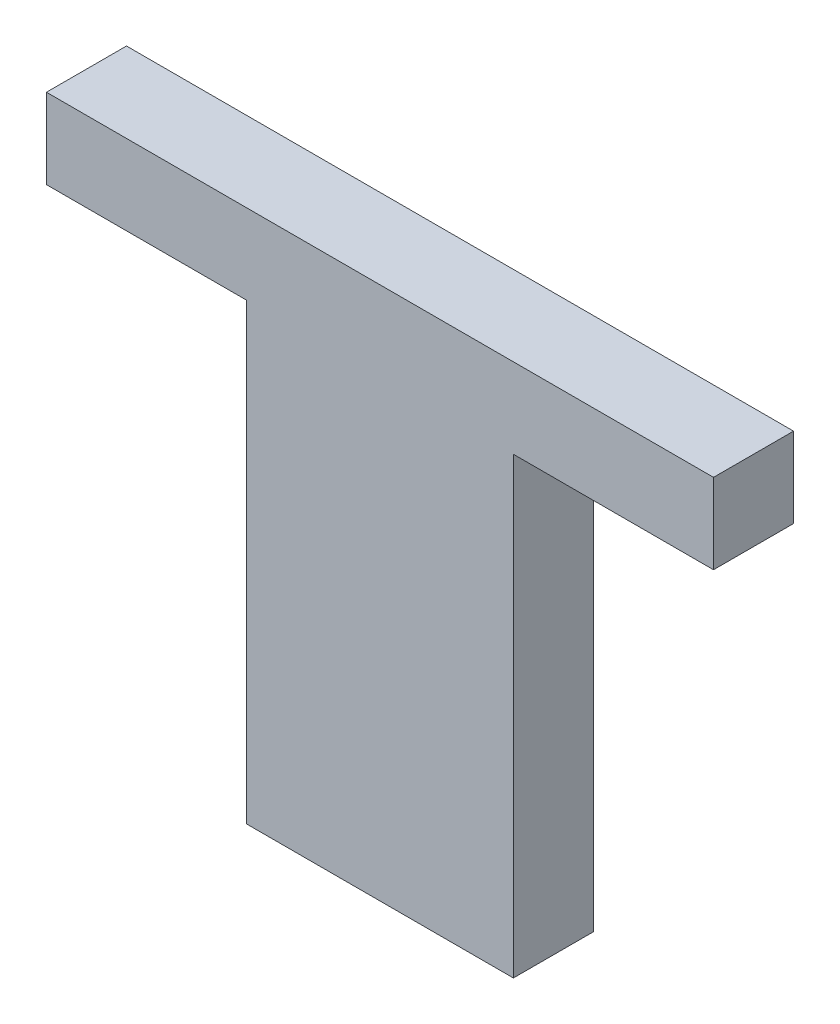
ISO-10303-21;
HEADER;
FILE_DESCRIPTION(('STEP AP214'),'2;1');
FILE_NAME('part.step','',(''),(''),'','','');
FILE_SCHEMA(('AUTOMOTIVE_DESIGN { 1 0 10303 214 1 1 1 1 }'));
ENDSEC;
DATA;
#1=APPLICATION_CONTEXT('core data for automotive mechanical design processes');
#2=APPLICATION_PROTOCOL_DEFINITION('international standard','automotive_design',2000,#1);
#3=PRODUCT_CONTEXT('',#1,'mechanical');
#4=PRODUCT('Part','Part','',(#3));
#5=PRODUCT_RELATED_PRODUCT_CATEGORY('part','',(#4));
#6=PRODUCT_DEFINITION_FORMATION('','',#4);
#7=PRODUCT_DEFINITION_CONTEXT('part definition',#1,'design');
#8=PRODUCT_DEFINITION('design','',#6,#7);
#9=PRODUCT_DEFINITION_SHAPE('','',#8);
#10=(LENGTH_UNIT() NAMED_UNIT(*) SI_UNIT(.MILLI.,.METRE.));
#11=(NAMED_UNIT(*) PLANE_ANGLE_UNIT() SI_UNIT($,.RADIAN.));
#12=(NAMED_UNIT(*) SI_UNIT($,.STERADIAN.) SOLID_ANGLE_UNIT());
#13=UNCERTAINTY_MEASURE_WITH_UNIT(LENGTH_MEASURE(1.E-05),#10,'distance_accuracy_value','');
#14=(GEOMETRIC_REPRESENTATION_CONTEXT(3) GLOBAL_UNCERTAINTY_ASSIGNED_CONTEXT((#13)) GLOBAL_UNIT_ASSIGNED_CONTEXT((#10,
#11,#12)) REPRESENTATION_CONTEXT('',''));
#15=CARTESIAN_POINT('',(0.,0.,0.));
#16=DIRECTION('',(0.,0.,1.));
#17=DIRECTION('',(1.,0.,0.));
#18=AXIS2_PLACEMENT_3D('',#15,#16,#17);
#19=CARTESIAN_POINT('',(0.,0.,6.));
#20=DIRECTION('',(1.,0.,0.));
#21=DIRECTION('',(0.,1.,0.));
#22=AXIS2_PLACEMENT_3D('',#19,#20,#21);
#23=PLANE('',#22);
#24=DIRECTION('',(0.,-1.,0.));
#25=VECTOR('',#24,1.);
#26=CARTESIAN_POINT('',(0.,0.,0.));
#27=LINE('',#26,#25);
#28=CARTESIAN_POINT('',(0.,40.,0.));
#29=VERTEX_POINT('',#28);
#30=CARTESIAN_POINT('',(0.,34.,0.));
#31=VERTEX_POINT('',#30);
#32=EDGE_CURVE('E123',#29,#31,#27,.T.);
#33=ORIENTED_EDGE('',*,*,#32,.T.);
#34=DIRECTION('',(0.,0.,1.));
#35=VECTOR('',#34,1.);
#36=CARTESIAN_POINT('',(0.,34.,0.));
#37=LINE('',#36,#35);
#38=CARTESIAN_POINT('',(0.,34.,6.));
#39=VERTEX_POINT('',#38);
#40=EDGE_CURVE('E139',#31,#39,#37,.T.);
#41=ORIENTED_EDGE('',*,*,#40,.T.);
#42=DIRECTION('',(0.,-1.,0.));
#43=VECTOR('',#42,1.);
#44=CARTESIAN_POINT('',(0.,0.,6.));
#45=LINE('',#44,#43);
#46=CARTESIAN_POINT('',(0.,40.,6.));
#47=VERTEX_POINT('',#46);
#48=EDGE_CURVE('E120',#47,#39,#45,.T.);
#49=ORIENTED_EDGE('',*,*,#48,.F.);
#50=DIRECTION('',(0.,0.,-1.));
#51=VECTOR('',#50,1.);
#52=CARTESIAN_POINT('',(0.,40.,6.));
#53=LINE('',#52,#51);
#54=EDGE_CURVE('E40',#47,#29,#53,.T.);
#55=ORIENTED_EDGE('',*,*,#54,.T.);
#56=EDGE_LOOP('',(#33,#41,#49,#55));
#57=FACE_BOUND('',#56,.T.);
#58=ADVANCED_FACE('F33',(#57),#23,.F.);
#59=CARTESIAN_POINT('',(0.,0.,6.));
#60=DIRECTION('',(0.,1.,0.));
#61=DIRECTION('',(0.,0.,1.));
#62=AXIS2_PLACEMENT_3D('',#59,#60,#61);
#63=PLANE('',#62);
#64=DIRECTION('',(1.,0.,0.));
#65=VECTOR('',#64,1.);
#66=CARTESIAN_POINT('',(0.,0.,0.));
#67=LINE('',#66,#65);
#68=CARTESIAN_POINT('',(15.,0.,0.));
#69=VERTEX_POINT('',#68);
#70=CARTESIAN_POINT('',(35.,0.,0.));
#71=VERTEX_POINT('',#70);
#72=EDGE_CURVE('E118',#69,#71,#67,.T.);
#73=ORIENTED_EDGE('',*,*,#72,.T.);
#74=DIRECTION('',(0.,0.,1.));
#75=VECTOR('',#74,1.);
#76=CARTESIAN_POINT('',(35.,0.,0.));
#77=LINE('',#76,#75);
#78=CARTESIAN_POINT('',(35.,0.,6.));
#79=VERTEX_POINT('',#78);
#80=EDGE_CURVE('E163',#71,#79,#77,.T.);
#81=ORIENTED_EDGE('',*,*,#80,.T.);
#82=DIRECTION('',(1.,0.,0.));
#83=VECTOR('',#82,1.);
#84=CARTESIAN_POINT('',(0.,0.,6.));
#85=LINE('',#84,#83);
#86=CARTESIAN_POINT('',(15.,0.,6.));
#87=VERTEX_POINT('',#86);
#88=EDGE_CURVE('E136',#87,#79,#85,.T.);
#89=ORIENTED_EDGE('',*,*,#88,.F.);
#90=DIRECTION('',(0.,0.,1.));
#91=VECTOR('',#90,1.);
#92=CARTESIAN_POINT('',(15.,0.,0.));
#93=LINE('',#92,#91);
#94=EDGE_CURVE('E143',#69,#87,#93,.T.);
#95=ORIENTED_EDGE('',*,*,#94,.F.);
#96=EDGE_LOOP('',(#73,#81,#89,#95));
#97=FACE_BOUND('',#96,.T.);
#98=ADVANCED_FACE('F161',(#97),#63,.F.);
#99=CARTESIAN_POINT('',(50.,0.,6.));
#100=DIRECTION('',(-1.,0.,0.));
#101=DIRECTION('',(0.,-1.,0.));
#102=AXIS2_PLACEMENT_3D('',#99,#100,#101);
#103=PLANE('',#102);
#104=DIRECTION('',(0.,1.,0.));
#105=VECTOR('',#104,1.);
#106=CARTESIAN_POINT('',(50.,0.,6.));
#107=LINE('',#106,#105);
#108=CARTESIAN_POINT('',(50.,34.,6.));
#109=VERTEX_POINT('',#108);
#110=CARTESIAN_POINT('',(50.,40.,6.));
#111=VERTEX_POINT('',#110);
#112=EDGE_CURVE('E112',#109,#111,#107,.T.);
#113=ORIENTED_EDGE('',*,*,#112,.F.);
#114=DIRECTION('',(0.,0.,1.));
#115=VECTOR('',#114,1.);
#116=CARTESIAN_POINT('',(50.,34.,0.));
#117=LINE('',#116,#115);
#118=CARTESIAN_POINT('',(50.,34.,0.));
#119=VERTEX_POINT('',#118);
#120=EDGE_CURVE('E100',#119,#109,#117,.T.);
#121=ORIENTED_EDGE('',*,*,#120,.F.);
#122=DIRECTION('',(0.,1.,0.));
#123=VECTOR('',#122,1.);
#124=CARTESIAN_POINT('',(50.,0.,0.));
#125=LINE('',#124,#123);
#126=CARTESIAN_POINT('',(50.,40.,0.));
#127=VERTEX_POINT('',#126);
#128=EDGE_CURVE('E111',#119,#127,#125,.T.);
#129=ORIENTED_EDGE('',*,*,#128,.T.);
#130=DIRECTION('',(0.,0.,-1.));
#131=VECTOR('',#130,1.);
#132=CARTESIAN_POINT('',(50.,40.,6.));
#133=LINE('',#132,#131);
#134=EDGE_CURVE('E11',#111,#127,#133,.T.);
#135=ORIENTED_EDGE('',*,*,#134,.F.);
#136=EDGE_LOOP('',(#113,#121,#129,#135));
#137=FACE_BOUND('',#136,.T.);
#138=ADVANCED_FACE('F109',(#137),#103,.F.);
#139=CARTESIAN_POINT('',(0.,40.,6.));
#140=DIRECTION('',(0.,-1.,0.));
#141=DIRECTION('',(0.,0.,-1.));
#142=AXIS2_PLACEMENT_3D('',#139,#140,#141);
#143=PLANE('',#142);
#144=DIRECTION('',(-1.,0.,0.));
#145=VECTOR('',#144,1.);
#146=CARTESIAN_POINT('',(0.,40.,0.));
#147=LINE('',#146,#145);
#148=EDGE_CURVE('E117',#127,#29,#147,.T.);
#149=ORIENTED_EDGE('',*,*,#148,.T.);
#150=ORIENTED_EDGE('',*,*,#54,.F.);
#151=DIRECTION('',(-1.,0.,0.));
#152=VECTOR('',#151,1.);
#153=CARTESIAN_POINT('',(0.,40.,6.));
#154=LINE('',#153,#152);
#155=EDGE_CURVE('E127',#111,#47,#154,.T.);
#156=ORIENTED_EDGE('',*,*,#155,.F.);
#157=ORIENTED_EDGE('',*,*,#134,.T.);
#158=EDGE_LOOP('',(#149,#150,#156,#157));
#159=FACE_BOUND('',#158,.T.);
#160=ADVANCED_FACE('F182',(#159),#143,.F.);
#161=CARTESIAN_POINT('',(0.,0.,6.));
#162=DIRECTION('',(0.,0.,-1.));
#163=DIRECTION('',(-1.,0.,0.));
#164=AXIS2_PLACEMENT_3D('',#161,#162,#163);
#165=PLANE('',#164);
#166=ORIENTED_EDGE('',*,*,#88,.T.);
#167=DIRECTION('',(0.,-1.,0.));
#168=VECTOR('',#167,1.);
#169=CARTESIAN_POINT('',(35.,0.,6.));
#170=LINE('',#169,#168);
#171=CARTESIAN_POINT('',(35.,34.,6.));
#172=VERTEX_POINT('',#171);
#173=EDGE_CURVE('E105',#172,#79,#170,.T.);
#174=ORIENTED_EDGE('',*,*,#173,.F.);
#175=DIRECTION('',(-1.,0.,0.));
#176=VECTOR('',#175,1.);
#177=CARTESIAN_POINT('',(50.,34.,6.));
#178=LINE('',#177,#176);
#179=EDGE_CURVE('E202',#109,#172,#178,.T.);
#180=ORIENTED_EDGE('',*,*,#179,.F.);
#181=ORIENTED_EDGE('',*,*,#112,.T.);
#182=ORIENTED_EDGE('',*,*,#155,.T.);
#183=ORIENTED_EDGE('',*,*,#48,.T.);
#184=DIRECTION('',(-1.,0.,0.));
#185=VECTOR('',#184,1.);
#186=CARTESIAN_POINT('',(0.,34.,6.));
#187=LINE('',#186,#185);
#188=CARTESIAN_POINT('',(15.,34.,6.));
#189=VERTEX_POINT('',#188);
#190=EDGE_CURVE('E146',#189,#39,#187,.T.);
#191=ORIENTED_EDGE('',*,*,#190,.F.);
#192=DIRECTION('',(0.,1.,0.));
#193=VECTOR('',#192,1.);
#194=CARTESIAN_POINT('',(15.,0.,6.));
#195=LINE('',#194,#193);
#196=EDGE_CURVE('E157',#87,#189,#195,.T.);
#197=ORIENTED_EDGE('',*,*,#196,.F.);
#198=EDGE_LOOP('',(#166,#174,#180,#181,#182,#183,#191,#197));
#199=FACE_BOUND('',#198,.T.);
#200=ADVANCED_FACE('F154',(#199),#165,.F.);
#201=CARTESIAN_POINT('',(0.,0.,0.));
#202=DIRECTION('',(0.,0.,-1.));
#203=DIRECTION('',(-1.,0.,0.));
#204=AXIS2_PLACEMENT_3D('',#201,#202,#203);
#205=PLANE('',#204);
#206=DIRECTION('',(0.,-1.,0.));
#207=VECTOR('',#206,1.);
#208=CARTESIAN_POINT('',(35.,0.,0.));
#209=LINE('',#208,#207);
#210=CARTESIAN_POINT('',(35.,34.,0.));
#211=VERTEX_POINT('',#210);
#212=EDGE_CURVE('E47',#211,#71,#209,.T.);
#213=ORIENTED_EDGE('',*,*,#212,.T.);
#214=ORIENTED_EDGE('',*,*,#72,.F.);
#215=DIRECTION('',(0.,1.,0.));
#216=VECTOR('',#215,1.);
#217=CARTESIAN_POINT('',(15.,0.,0.));
#218=LINE('',#217,#216);
#219=CARTESIAN_POINT('',(15.,34.,0.));
#220=VERTEX_POINT('',#219);
#221=EDGE_CURVE('E169',#69,#220,#218,.T.);
#222=ORIENTED_EDGE('',*,*,#221,.T.);
#223=DIRECTION('',(-1.,0.,0.));
#224=VECTOR('',#223,1.);
#225=CARTESIAN_POINT('',(0.,34.,0.));
#226=LINE('',#225,#224);
#227=EDGE_CURVE('E55',#220,#31,#226,.T.);
#228=ORIENTED_EDGE('',*,*,#227,.T.);
#229=ORIENTED_EDGE('',*,*,#32,.F.);
#230=ORIENTED_EDGE('',*,*,#148,.F.);
#231=ORIENTED_EDGE('',*,*,#128,.F.);
#232=DIRECTION('',(-1.,0.,0.));
#233=VECTOR('',#232,1.);
#234=CARTESIAN_POINT('',(50.,34.,0.));
#235=LINE('',#234,#233);
#236=EDGE_CURVE('E96',#119,#211,#235,.T.);
#237=ORIENTED_EDGE('',*,*,#236,.T.);
#238=EDGE_LOOP('',(#213,#214,#222,#228,#229,#230,#231,#237));
#239=FACE_BOUND('',#238,.T.);
#240=ADVANCED_FACE('F115',(#239),#205,.T.);
#241=CARTESIAN_POINT('',(0.,34.,0.));
#242=DIRECTION('',(0.,1.,0.));
#243=DIRECTION('',(0.,0.,1.));
#244=AXIS2_PLACEMENT_3D('',#241,#242,#243);
#245=PLANE('',#244);
#246=ORIENTED_EDGE('',*,*,#190,.T.);
#247=ORIENTED_EDGE('',*,*,#40,.F.);
#248=ORIENTED_EDGE('',*,*,#227,.F.);
#249=DIRECTION('',(0.,0.,1.));
#250=VECTOR('',#249,1.);
#251=CARTESIAN_POINT('',(15.,34.,0.));
#252=LINE('',#251,#250);
#253=EDGE_CURVE('E141',#220,#189,#252,.T.);
#254=ORIENTED_EDGE('',*,*,#253,.T.);
#255=EDGE_LOOP('',(#246,#247,#248,#254));
#256=FACE_BOUND('',#255,.T.);
#257=ADVANCED_FACE('F174',(#256),#245,.F.);
#258=CARTESIAN_POINT('',(15.,0.,0.));
#259=DIRECTION('',(1.,0.,0.));
#260=DIRECTION('',(0.,0.,-1.));
#261=AXIS2_PLACEMENT_3D('',#258,#259,#260);
#262=PLANE('',#261);
#263=ORIENTED_EDGE('',*,*,#196,.T.);
#264=ORIENTED_EDGE('',*,*,#253,.F.);
#265=ORIENTED_EDGE('',*,*,#221,.F.);
#266=ORIENTED_EDGE('',*,*,#94,.T.);
#267=EDGE_LOOP('',(#263,#264,#265,#266));
#268=FACE_BOUND('',#267,.T.);
#269=ADVANCED_FACE('F173',(#268),#262,.F.);
#270=CARTESIAN_POINT('',(35.,0.,0.));
#271=DIRECTION('',(-1.,0.,0.));
#272=DIRECTION('',(0.,0.,1.));
#273=AXIS2_PLACEMENT_3D('',#270,#271,#272);
#274=PLANE('',#273);
#275=ORIENTED_EDGE('',*,*,#173,.T.);
#276=ORIENTED_EDGE('',*,*,#80,.F.);
#277=ORIENTED_EDGE('',*,*,#212,.F.);
#278=DIRECTION('',(0.,0.,1.));
#279=VECTOR('',#278,1.);
#280=CARTESIAN_POINT('',(35.,34.,0.));
#281=LINE('',#280,#279);
#282=EDGE_CURVE('E102',#211,#172,#281,.T.);
#283=ORIENTED_EDGE('',*,*,#282,.T.);
#284=EDGE_LOOP('',(#275,#276,#277,#283));
#285=FACE_BOUND('',#284,.T.);
#286=ADVANCED_FACE('F194',(#285),#274,.F.);
#287=CARTESIAN_POINT('',(50.,34.,0.));
#288=DIRECTION('',(0.,1.,0.));
#289=DIRECTION('',(0.,0.,1.));
#290=AXIS2_PLACEMENT_3D('',#287,#288,#289);
#291=PLANE('',#290);
#292=ORIENTED_EDGE('',*,*,#179,.T.);
#293=ORIENTED_EDGE('',*,*,#282,.F.);
#294=ORIENTED_EDGE('',*,*,#236,.F.);
#295=ORIENTED_EDGE('',*,*,#120,.T.);
#296=EDGE_LOOP('',(#292,#293,#294,#295));
#297=FACE_BOUND('',#296,.T.);
#298=ADVANCED_FACE('F99',(#297),#291,.F.);
#299=CLOSED_SHELL('',(#58,#98,#138,#160,#200,#240,#257,#269,#286,#298));
#300=MANIFOLD_SOLID_BREP('B2',#299);
#301=ADVANCED_BREP_SHAPE_REPRESENTATION('',(#18,#300),#14);
#302=SHAPE_DEFINITION_REPRESENTATION(#9,#301);
ENDSEC;
END-ISO-10303-21;
